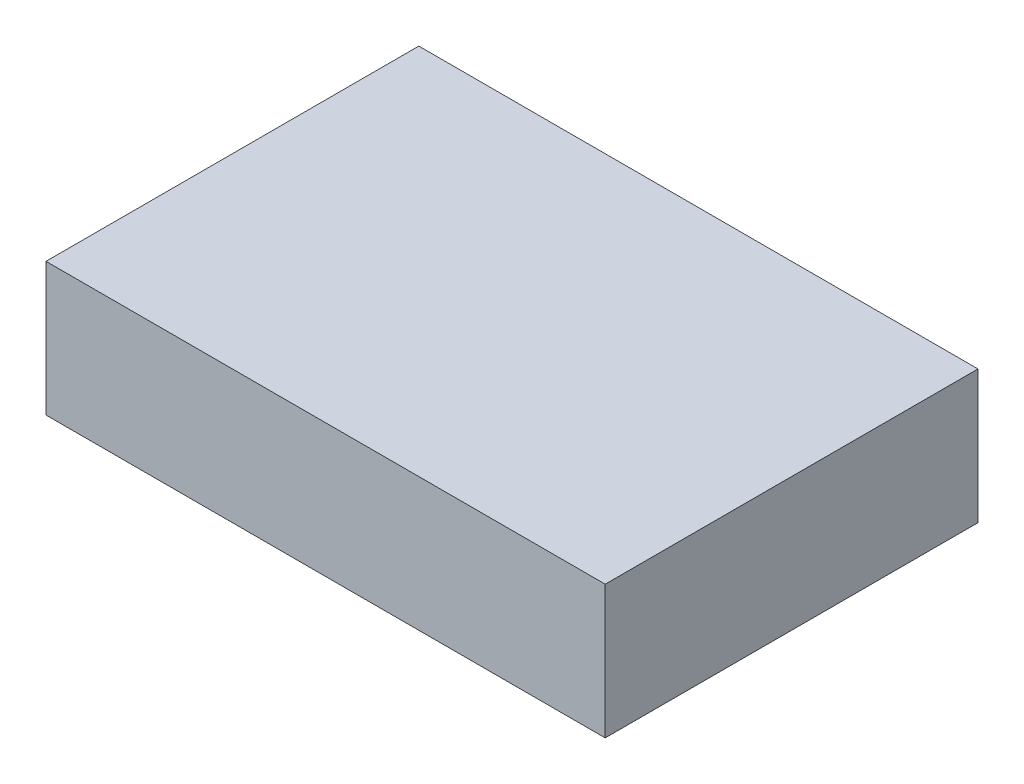
ISO-10303-21;
HEADER;
FILE_DESCRIPTION(('STEP AP214'),'2;1');
FILE_NAME('part.step','',(''),(''),'','','');
FILE_SCHEMA(('AUTOMOTIVE_DESIGN { 1 0 10303 214 1 1 1 1 }'));
ENDSEC;
DATA;
#1=APPLICATION_CONTEXT('core data for automotive mechanical design processes');
#2=APPLICATION_PROTOCOL_DEFINITION('international standard','automotive_design',2000,#1);
#3=PRODUCT_CONTEXT('',#1,'mechanical');
#4=PRODUCT('Part','Part','',(#3));
#5=PRODUCT_RELATED_PRODUCT_CATEGORY('part','',(#4));
#6=PRODUCT_DEFINITION_FORMATION('','',#4);
#7=PRODUCT_DEFINITION_CONTEXT('part definition',#1,'design');
#8=PRODUCT_DEFINITION('design','',#6,#7);
#9=PRODUCT_DEFINITION_SHAPE('','',#8);
#10=(LENGTH_UNIT() NAMED_UNIT(*) SI_UNIT(.MILLI.,.METRE.));
#11=(NAMED_UNIT(*) PLANE_ANGLE_UNIT() SI_UNIT($,.RADIAN.));
#12=(NAMED_UNIT(*) SI_UNIT($,.STERADIAN.) SOLID_ANGLE_UNIT());
#13=UNCERTAINTY_MEASURE_WITH_UNIT(LENGTH_MEASURE(1.E-05),#10,'distance_accuracy_value','');
#14=(GEOMETRIC_REPRESENTATION_CONTEXT(3) GLOBAL_UNCERTAINTY_ASSIGNED_CONTEXT((#13)) GLOBAL_UNIT_ASSIGNED_CONTEXT((#10,
#11,#12)) REPRESENTATION_CONTEXT('',''));
#15=CARTESIAN_POINT('',(0.,0.,0.));
#16=DIRECTION('',(0.,0.,1.));
#17=DIRECTION('',(1.,0.,0.));
#18=AXIS2_PLACEMENT_3D('',#15,#16,#17);
#19=CARTESIAN_POINT('',(10.5,5.,-7.));
#20=DIRECTION('',(-1.,0.,0.));
#21=DIRECTION('',(0.,0.,1.));
#22=AXIS2_PLACEMENT_3D('',#19,#20,#21);
#23=PLANE('',#22);
#24=DIRECTION('',(0.,0.,-1.));
#25=VECTOR('',#24,1.);
#26=CARTESIAN_POINT('',(10.5,0.,-7.));
#27=LINE('',#26,#25);
#28=CARTESIAN_POINT('',(10.5,0.,7.));
#29=VERTEX_POINT('',#28);
#30=CARTESIAN_POINT('',(10.5,0.,-7.));
#31=VERTEX_POINT('',#30);
#32=EDGE_CURVE('E98',#29,#31,#27,.T.);
#33=ORIENTED_EDGE('',*,*,#32,.T.);
#34=DIRECTION('',(0.,-1.,0.));
#35=VECTOR('',#34,1.);
#36=CARTESIAN_POINT('',(10.5,5.,-7.));
#37=LINE('',#36,#35);
#38=CARTESIAN_POINT('',(10.5,5.,-7.));
#39=VERTEX_POINT('',#38);
#40=EDGE_CURVE('E11',#39,#31,#37,.T.);
#41=ORIENTED_EDGE('',*,*,#40,.F.);
#42=DIRECTION('',(0.,0.,-1.));
#43=VECTOR('',#42,1.);
#44=CARTESIAN_POINT('',(10.5,5.,-7.));
#45=LINE('',#44,#43);
#46=CARTESIAN_POINT('',(10.5,5.,7.));
#47=VERTEX_POINT('',#46);
#48=EDGE_CURVE('E86',#47,#39,#45,.T.);
#49=ORIENTED_EDGE('',*,*,#48,.F.);
#50=DIRECTION('',(0.,-1.,0.));
#51=VECTOR('',#50,1.);
#52=CARTESIAN_POINT('',(10.5,5.,7.));
#53=LINE('',#52,#51);
#54=EDGE_CURVE('E94',#47,#29,#53,.T.);
#55=ORIENTED_EDGE('',*,*,#54,.T.);
#56=EDGE_LOOP('',(#33,#41,#49,#55));
#57=FACE_BOUND('',#56,.T.);
#58=ADVANCED_FACE('F35',(#57),#23,.F.);
#59=CARTESIAN_POINT('',(-10.5,5.,-7.));
#60=DIRECTION('',(0.,0.,1.));
#61=DIRECTION('',(1.,0.,0.));
#62=AXIS2_PLACEMENT_3D('',#59,#60,#61);
#63=PLANE('',#62);
#64=DIRECTION('',(-1.,0.,0.));
#65=VECTOR('',#64,1.);
#66=CARTESIAN_POINT('',(-10.5,0.,-7.));
#67=LINE('',#66,#65);
#68=CARTESIAN_POINT('',(-10.5,0.,-7.));
#69=VERTEX_POINT('',#68);
#70=EDGE_CURVE('E90',#31,#69,#67,.T.);
#71=ORIENTED_EDGE('',*,*,#70,.T.);
#72=DIRECTION('',(0.,-1.,0.));
#73=VECTOR('',#72,1.);
#74=CARTESIAN_POINT('',(-10.5,5.,-7.));
#75=LINE('',#74,#73);
#76=CARTESIAN_POINT('',(-10.5,5.,-7.));
#77=VERTEX_POINT('',#76);
#78=EDGE_CURVE('E43',#77,#69,#75,.T.);
#79=ORIENTED_EDGE('',*,*,#78,.F.);
#80=DIRECTION('',(-1.,0.,0.));
#81=VECTOR('',#80,1.);
#82=CARTESIAN_POINT('',(-10.5,5.,-7.));
#83=LINE('',#82,#81);
#84=EDGE_CURVE('E81',#39,#77,#83,.T.);
#85=ORIENTED_EDGE('',*,*,#84,.F.);
#86=ORIENTED_EDGE('',*,*,#40,.T.);
#87=EDGE_LOOP('',(#71,#79,#85,#86));
#88=FACE_BOUND('',#87,.T.);
#89=ADVANCED_FACE('F89',(#88),#63,.F.);
#90=CARTESIAN_POINT('',(-10.5,5.,-7.));
#91=DIRECTION('',(1.,0.,0.));
#92=DIRECTION('',(0.,0.,-1.));
#93=AXIS2_PLACEMENT_3D('',#90,#91,#92);
#94=PLANE('',#93);
#95=DIRECTION('',(0.,0.,1.));
#96=VECTOR('',#95,1.);
#97=CARTESIAN_POINT('',(-10.5,0.,-7.));
#98=LINE('',#97,#96);
#99=CARTESIAN_POINT('',(-10.5,0.,7.));
#100=VERTEX_POINT('',#99);
#101=EDGE_CURVE('E68',#69,#100,#98,.T.);
#102=ORIENTED_EDGE('',*,*,#101,.T.);
#103=DIRECTION('',(0.,-1.,0.));
#104=VECTOR('',#103,1.);
#105=CARTESIAN_POINT('',(-10.5,5.,7.));
#106=LINE('',#105,#104);
#107=CARTESIAN_POINT('',(-10.5,5.,7.));
#108=VERTEX_POINT('',#107);
#109=EDGE_CURVE('E91',#108,#100,#106,.T.);
#110=ORIENTED_EDGE('',*,*,#109,.F.);
#111=DIRECTION('',(0.,0.,1.));
#112=VECTOR('',#111,1.);
#113=CARTESIAN_POINT('',(-10.5,5.,-7.));
#114=LINE('',#113,#112);
#115=EDGE_CURVE('E84',#77,#108,#114,.T.);
#116=ORIENTED_EDGE('',*,*,#115,.F.);
#117=ORIENTED_EDGE('',*,*,#78,.T.);
#118=EDGE_LOOP('',(#102,#110,#116,#117));
#119=FACE_BOUND('',#118,.T.);
#120=ADVANCED_FACE('F92',(#119),#94,.F.);
#121=CARTESIAN_POINT('',(-10.5,5.,7.));
#122=DIRECTION('',(0.,0.,-1.));
#123=DIRECTION('',(-1.,0.,0.));
#124=AXIS2_PLACEMENT_3D('',#121,#122,#123);
#125=PLANE('',#124);
#126=DIRECTION('',(1.,0.,0.));
#127=VECTOR('',#126,1.);
#128=CARTESIAN_POINT('',(-10.5,0.,7.));
#129=LINE('',#128,#127);
#130=EDGE_CURVE('E74',#100,#29,#129,.T.);
#131=ORIENTED_EDGE('',*,*,#130,.T.);
#132=ORIENTED_EDGE('',*,*,#54,.F.);
#133=DIRECTION('',(1.,0.,0.));
#134=VECTOR('',#133,1.);
#135=CARTESIAN_POINT('',(-10.5,5.,7.));
#136=LINE('',#135,#134);
#137=EDGE_CURVE('E51',#108,#47,#136,.T.);
#138=ORIENTED_EDGE('',*,*,#137,.F.);
#139=ORIENTED_EDGE('',*,*,#109,.T.);
#140=EDGE_LOOP('',(#131,#132,#138,#139));
#141=FACE_BOUND('',#140,.T.);
#142=ADVANCED_FACE('F105',(#141),#125,.F.);
#143=CARTESIAN_POINT('',(0.,5.,0.));
#144=DIRECTION('',(0.,1.,0.));
#145=DIRECTION('',(0.,0.,1.));
#146=AXIS2_PLACEMENT_3D('',#143,#144,#145);
#147=PLANE('',#146);
#148=ORIENTED_EDGE('',*,*,#48,.T.);
#149=ORIENTED_EDGE('',*,*,#84,.T.);
#150=ORIENTED_EDGE('',*,*,#115,.T.);
#151=ORIENTED_EDGE('',*,*,#137,.T.);
#152=EDGE_LOOP('',(#148,#149,#150,#151));
#153=FACE_BOUND('',#152,.T.);
#154=ADVANCED_FACE('F82',(#153),#147,.T.);
#155=CARTESIAN_POINT('',(0.,0.,0.));
#156=DIRECTION('',(0.,1.,0.));
#157=DIRECTION('',(0.,0.,1.));
#158=AXIS2_PLACEMENT_3D('',#155,#156,#157);
#159=PLANE('',#158);
#160=ORIENTED_EDGE('',*,*,#32,.F.);
#161=ORIENTED_EDGE('',*,*,#130,.F.);
#162=ORIENTED_EDGE('',*,*,#101,.F.);
#163=ORIENTED_EDGE('',*,*,#70,.F.);
#164=EDGE_LOOP('',(#160,#161,#162,#163));
#165=FACE_BOUND('',#164,.T.);
#166=ADVANCED_FACE('F108',(#165),#159,.F.);
#167=CLOSED_SHELL('',(#58,#89,#120,#142,#154,#166));
#168=MANIFOLD_SOLID_BREP('B2',#167);
#169=ADVANCED_BREP_SHAPE_REPRESENTATION('',(#18,#168),#14);
#170=SHAPE_DEFINITION_REPRESENTATION(#9,#169);
ENDSEC;
END-ISO-10303-21;
